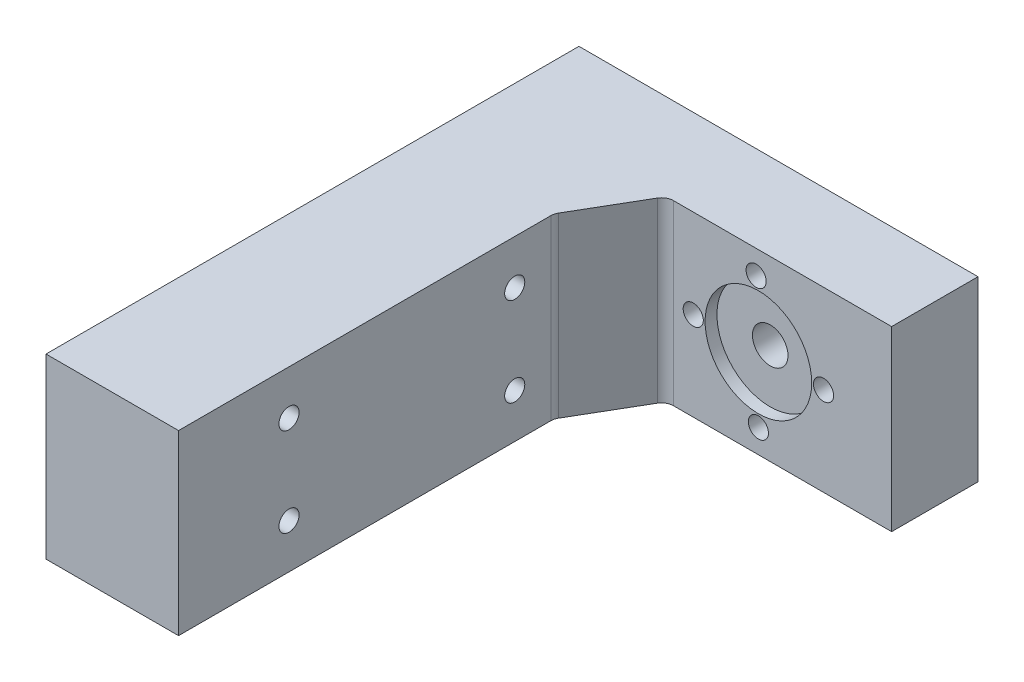
ISO-10303-21;
HEADER;
FILE_DESCRIPTION(('STEP AP214'),'2;1');
FILE_NAME('part.step','',(''),(''),'','','');
FILE_SCHEMA(('AUTOMOTIVE_DESIGN { 1 0 10303 214 1 1 1 1 }'));
ENDSEC;
DATA;
#1=APPLICATION_CONTEXT('core data for automotive mechanical design processes');
#2=APPLICATION_PROTOCOL_DEFINITION('international standard','automotive_design',2000,#1);
#3=PRODUCT_CONTEXT('',#1,'mechanical');
#4=PRODUCT('Part','Part','',(#3));
#5=PRODUCT_RELATED_PRODUCT_CATEGORY('part','',(#4));
#6=PRODUCT_DEFINITION_FORMATION('','',#4);
#7=PRODUCT_DEFINITION_CONTEXT('part definition',#1,'design');
#8=PRODUCT_DEFINITION('design','',#6,#7);
#9=PRODUCT_DEFINITION_SHAPE('','',#8);
#10=(LENGTH_UNIT() NAMED_UNIT(*) SI_UNIT(.MILLI.,.METRE.));
#11=(NAMED_UNIT(*) PLANE_ANGLE_UNIT() SI_UNIT($,.RADIAN.));
#12=(NAMED_UNIT(*) SI_UNIT($,.STERADIAN.) SOLID_ANGLE_UNIT());
#13=UNCERTAINTY_MEASURE_WITH_UNIT(LENGTH_MEASURE(1.E-05),#10,'distance_accuracy_value','');
#14=(GEOMETRIC_REPRESENTATION_CONTEXT(3) GLOBAL_UNCERTAINTY_ASSIGNED_CONTEXT((#13)) GLOBAL_UNIT_ASSIGNED_CONTEXT((#10,
#11,#12)) REPRESENTATION_CONTEXT('',''));
#15=CARTESIAN_POINT('',(0.,0.,0.));
#16=DIRECTION('',(0.,0.,1.));
#17=DIRECTION('',(1.,0.,0.));
#18=AXIS2_PLACEMENT_3D('',#15,#16,#17);
#19=CARTESIAN_POINT('',(-456.223221322454,150.000100005572,321.794313538758));
#20=DIRECTION('',(0.,0.,1.));
#21=DIRECTION('',(1.,0.,0.));
#22=AXIS2_PLACEMENT_3D('',#19,#20,#21);
#23=CYLINDRICAL_SURFACE('',#22,3.);
#24=CARTESIAN_POINT('',(-456.223221322454,150.000100005572,321.794313538758));
#25=DIRECTION('',(0.,0.,1.));
#26=DIRECTION('',(1.,0.,0.));
#27=AXIS2_PLACEMENT_3D('',#24,#25,#26);
#28=CIRCLE('',#27,3.);
#29=CARTESIAN_POINT('',(-453.223221322454,150.000100005572,321.794313538758));
#30=VERTEX_POINT('',#29);
#31=EDGE_CURVE('E164',#30,#30,#28,.T.);
#32=ORIENTED_EDGE('',*,*,#31,.F.);
#33=EDGE_LOOP('',(#32));
#34=FACE_BOUND('',#33,.T.);
#35=CARTESIAN_POINT('',(-456.223221322454,150.000100005572,334.378645983454));
#36=DIRECTION('',(0.,0.,1.));
#37=DIRECTION('',(1.,0.,0.));
#38=AXIS2_PLACEMENT_3D('',#35,#36,#37);
#39=CIRCLE('',#38,3.);
#40=CARTESIAN_POINT('',(-453.223221322454,150.000100005572,334.378645983454));
#41=VERTEX_POINT('',#40);
#42=EDGE_CURVE('E162',#41,#41,#39,.F.);
#43=ORIENTED_EDGE('',*,*,#42,.F.);
#44=EDGE_LOOP('',(#43));
#45=FACE_BOUND('',#44,.T.);
#46=ADVANCED_FACE('F55',(#34,#45),#23,.F.);
#47=CARTESIAN_POINT('',(-433.723221322454,165.000100005572,336.378645983454));
#48=DIRECTION('',(-1.,0.,0.));
#49=DIRECTION('',(0.,0.,1.));
#50=AXIS2_PLACEMENT_3D('',#47,#48,#49);
#51=PLANE('',#50);
#52=DIRECTION('',(0.,0.,-1.));
#53=VECTOR('',#52,1.);
#54=CARTESIAN_POINT('',(-433.723221322454,135.000100005572,336.378645983454));
#55=LINE('',#54,#53);
#56=CARTESIAN_POINT('',(-433.723221322454,135.000100005572,336.378645983454));
#57=VERTEX_POINT('',#56);
#58=CARTESIAN_POINT('',(-433.723221322454,135.000100005572,321.794313538758));
#59=VERTEX_POINT('',#58);
#60=EDGE_CURVE('E148',#57,#59,#55,.T.);
#61=ORIENTED_EDGE('',*,*,#60,.T.);
#62=DIRECTION('',(0.,-1.,0.));
#63=VECTOR('',#62,1.);
#64=CARTESIAN_POINT('',(-433.723221322454,165.000100005572,321.794313538758));
#65=LINE('',#64,#63);
#66=CARTESIAN_POINT('',(-433.723221322454,165.000100005572,321.794313538758));
#67=VERTEX_POINT('',#66);
#68=EDGE_CURVE('E129',#67,#59,#65,.T.);
#69=ORIENTED_EDGE('',*,*,#68,.F.);
#70=DIRECTION('',(0.,0.,-1.));
#71=VECTOR('',#70,1.);
#72=CARTESIAN_POINT('',(-433.723221322454,165.000100005572,336.378645983454));
#73=LINE('',#72,#71);
#74=CARTESIAN_POINT('',(-433.723221322454,165.000100005572,336.378645983454));
#75=VERTEX_POINT('',#74);
#76=EDGE_CURVE('E138',#75,#67,#73,.T.);
#77=ORIENTED_EDGE('',*,*,#76,.F.);
#78=DIRECTION('',(0.,-1.,0.));
#79=VECTOR('',#78,1.);
#80=CARTESIAN_POINT('',(-433.723221322454,165.000100005572,336.378645983454));
#81=LINE('',#80,#79);
#82=EDGE_CURVE('E218',#75,#57,#81,.T.);
#83=ORIENTED_EDGE('',*,*,#82,.T.);
#84=EDGE_LOOP('',(#61,#69,#77,#83));
#85=FACE_BOUND('',#84,.T.);
#86=ADVANCED_FACE('F149',(#85),#51,.F.);
#87=CARTESIAN_POINT('',(-433.723221322454,165.000100005572,321.794313538758));
#88=DIRECTION('',(0.,0.,1.));
#89=DIRECTION('',(1.,0.,0.));
#90=AXIS2_PLACEMENT_3D('',#87,#88,#89);
#91=PLANE('',#90);
#92=CARTESIAN_POINT('',(-467.223221322454,150.000100005572,321.794313538758));
#93=DIRECTION('',(0.,0.,1.));
#94=DIRECTION('',(1.,0.,0.));
#95=AXIS2_PLACEMENT_3D('',#92,#93,#94);
#96=CIRCLE('',#95,1.7);
#97=CARTESIAN_POINT('',(-465.523221322454,150.000100005572,321.794313538758));
#98=VERTEX_POINT('',#97);
#99=EDGE_CURVE('E240',#98,#98,#96,.T.);
#100=ORIENTED_EDGE('',*,*,#99,.T.);
#101=EDGE_LOOP('',(#100));
#102=FACE_BOUND('',#101,.T.);
#103=ORIENTED_EDGE('',*,*,#31,.T.);
#104=EDGE_LOOP('',(#103));
#105=FACE_BOUND('',#104,.T.);
#106=CARTESIAN_POINT('',(-456.223221322454,139.000100005572,321.794313538758));
#107=DIRECTION('',(0.,0.,1.));
#108=DIRECTION('',(1.,0.,0.));
#109=AXIS2_PLACEMENT_3D('',#106,#107,#108);
#110=CIRCLE('',#109,1.7);
#111=CARTESIAN_POINT('',(-454.523221322454,139.000100005572,321.794313538758));
#112=VERTEX_POINT('',#111);
#113=EDGE_CURVE('E270',#112,#112,#110,.T.);
#114=ORIENTED_EDGE('',*,*,#113,.T.);
#115=EDGE_LOOP('',(#114));
#116=FACE_BOUND('',#115,.T.);
#117=CARTESIAN_POINT('',(-445.223221322454,150.000100005572,321.794313538758));
#118=DIRECTION('',(0.,0.,1.));
#119=DIRECTION('',(1.,0.,0.));
#120=AXIS2_PLACEMENT_3D('',#117,#118,#119);
#121=CIRCLE('',#120,1.7);
#122=CARTESIAN_POINT('',(-443.523221322454,150.000100005572,321.794313538758));
#123=VERTEX_POINT('',#122);
#124=EDGE_CURVE('E246',#123,#123,#121,.T.);
#125=ORIENTED_EDGE('',*,*,#124,.T.);
#126=EDGE_LOOP('',(#125));
#127=FACE_BOUND('',#126,.T.);
#128=CARTESIAN_POINT('',(-456.605519190283,160.993454741059,321.794313538758));
#129=DIRECTION('',(0.,0.,1.));
#130=DIRECTION('',(1.,0.,0.));
#131=AXIS2_PLACEMENT_3D('',#128,#129,#130);
#132=CIRCLE('',#131,1.7);
#133=CARTESIAN_POINT('',(-454.905519190283,160.993454741059,321.794313538758));
#134=VERTEX_POINT('',#133);
#135=EDGE_CURVE('E253',#134,#134,#132,.T.);
#136=ORIENTED_EDGE('',*,*,#135,.T.);
#137=EDGE_LOOP('',(#136));
#138=FACE_BOUND('',#137,.T.);
#139=DIRECTION('',(-1.,0.,0.));
#140=VECTOR('',#139,1.);
#141=CARTESIAN_POINT('',(-433.723221322454,135.000100005572,321.794313538758));
#142=LINE('',#141,#140);
#143=CARTESIAN_POINT('',(-501.108556190435,135.000100005572,321.794313538758));
#144=VERTEX_POINT('',#143);
#145=EDGE_CURVE('E229',#59,#144,#142,.T.);
#146=ORIENTED_EDGE('',*,*,#145,.T.);
#147=DIRECTION('',(0.,-1.,0.));
#148=VECTOR('',#147,1.);
#149=CARTESIAN_POINT('',(-501.108556190435,165.000100005572,321.794313538758));
#150=LINE('',#149,#148);
#151=CARTESIAN_POINT('',(-501.108556190435,165.000100005572,321.794313538758));
#152=VERTEX_POINT('',#151);
#153=EDGE_CURVE('E133',#152,#144,#150,.T.);
#154=ORIENTED_EDGE('',*,*,#153,.F.);
#155=DIRECTION('',(-1.,0.,0.));
#156=VECTOR('',#155,1.);
#157=CARTESIAN_POINT('',(-433.723221322454,165.000100005572,321.794313538758));
#158=LINE('',#157,#156);
#159=EDGE_CURVE('E121',#67,#152,#158,.T.);
#160=ORIENTED_EDGE('',*,*,#159,.F.);
#161=ORIENTED_EDGE('',*,*,#68,.T.);
#162=EDGE_LOOP('',(#146,#154,#160,#161));
#163=FACE_BOUND('',#162,.T.);
#164=ADVANCED_FACE('F127',(#102,#105,#116,#127,#138,#163),#91,.F.);
#165=CARTESIAN_POINT('',(-501.108556190435,165.000100005572,321.794313538758));
#166=DIRECTION('',(1.,0.,0.));
#167=DIRECTION('',(0.,0.,-1.));
#168=AXIS2_PLACEMENT_3D('',#165,#166,#167);
#169=PLANE('',#168);
#170=CARTESIAN_POINT('',(-501.108556190435,157.500100005572,393.144313538758));
#171=DIRECTION('',(1.,0.,0.));
#172=DIRECTION('',(0.,0.,-1.));
#173=AXIS2_PLACEMENT_3D('',#170,#171,#172);
#174=CIRCLE('',#173,1.7);
#175=CARTESIAN_POINT('',(-501.108556190435,157.500100005572,391.444313538758));
#176=VERTEX_POINT('',#175);
#177=EDGE_CURVE('E304',#176,#176,#174,.T.);
#178=ORIENTED_EDGE('',*,*,#177,.T.);
#179=EDGE_LOOP('',(#178));
#180=FACE_BOUND('',#179,.T.);
#181=CARTESIAN_POINT('',(-501.108556190435,142.500100005572,355.028645983454));
#182=DIRECTION('',(1.,0.,0.));
#183=DIRECTION('',(0.,0.,-1.));
#184=AXIS2_PLACEMENT_3D('',#181,#182,#183);
#185=CIRCLE('',#184,1.7);
#186=CARTESIAN_POINT('',(-501.108556190435,142.500100005572,353.328645983454));
#187=VERTEX_POINT('',#186);
#188=EDGE_CURVE('E298',#187,#187,#185,.T.);
#189=ORIENTED_EDGE('',*,*,#188,.T.);
#190=EDGE_LOOP('',(#189));
#191=FACE_BOUND('',#190,.T.);
#192=CARTESIAN_POINT('',(-501.108556190435,157.500100005572,355.028645983454));
#193=DIRECTION('',(1.,0.,0.));
#194=DIRECTION('',(0.,0.,-1.));
#195=AXIS2_PLACEMENT_3D('',#192,#193,#194);
#196=CIRCLE('',#195,1.7);
#197=CARTESIAN_POINT('',(-501.108556190435,157.500100005572,353.328645983454));
#198=VERTEX_POINT('',#197);
#199=EDGE_CURVE('E315',#198,#198,#196,.T.);
#200=ORIENTED_EDGE('',*,*,#199,.T.);
#201=EDGE_LOOP('',(#200));
#202=FACE_BOUND('',#201,.T.);
#203=CARTESIAN_POINT('',(-501.108556190435,142.500100005572,393.144313538758));
#204=DIRECTION('',(1.,0.,0.));
#205=DIRECTION('',(0.,0.,-1.));
#206=AXIS2_PLACEMENT_3D('',#203,#204,#205);
#207=CIRCLE('',#206,1.7);
#208=CARTESIAN_POINT('',(-501.108556190435,142.500100005572,391.444313538758));
#209=VERTEX_POINT('',#208);
#210=EDGE_CURVE('E284',#209,#209,#207,.T.);
#211=ORIENTED_EDGE('',*,*,#210,.T.);
#212=EDGE_LOOP('',(#211));
#213=FACE_BOUND('',#212,.T.);
#214=DIRECTION('',(0.,0.,1.));
#215=VECTOR('',#214,1.);
#216=CARTESIAN_POINT('',(-501.108556190435,135.000100005572,321.794313538758));
#217=LINE('',#216,#215);
#218=CARTESIAN_POINT('',(-501.108556190435,135.000100005572,411.794313538758));
#219=VERTEX_POINT('',#218);
#220=EDGE_CURVE('E215',#144,#219,#217,.T.);
#221=ORIENTED_EDGE('',*,*,#220,.T.);
#222=DIRECTION('',(0.,-1.,0.));
#223=VECTOR('',#222,1.);
#224=CARTESIAN_POINT('',(-501.108556190435,165.000100005572,411.794313538758));
#225=LINE('',#224,#223);
#226=CARTESIAN_POINT('',(-501.108556190435,165.000100005572,411.794313538758));
#227=VERTEX_POINT('',#226);
#228=EDGE_CURVE('E156',#227,#219,#225,.T.);
#229=ORIENTED_EDGE('',*,*,#228,.F.);
#230=DIRECTION('',(0.,0.,1.));
#231=VECTOR('',#230,1.);
#232=CARTESIAN_POINT('',(-501.108556190435,165.000100005572,321.794313538758));
#233=LINE('',#232,#231);
#234=EDGE_CURVE('E132',#152,#227,#233,.T.);
#235=ORIENTED_EDGE('',*,*,#234,.F.);
#236=ORIENTED_EDGE('',*,*,#153,.T.);
#237=EDGE_LOOP('',(#221,#229,#235,#236));
#238=FACE_BOUND('',#237,.T.);
#239=ADVANCED_FACE('F380',(#180,#191,#202,#213,#238),#169,.F.);
#240=CARTESIAN_POINT('',(-501.108556190435,165.000100005572,411.794313538758));
#241=DIRECTION('',(0.,0.,-1.));
#242=DIRECTION('',(-1.,0.,0.));
#243=AXIS2_PLACEMENT_3D('',#240,#241,#242);
#244=PLANE('',#243);
#245=DIRECTION('',(1.,0.,0.));
#246=VECTOR('',#245,1.);
#247=CARTESIAN_POINT('',(-501.108556190435,135.000100005572,411.794313538758));
#248=LINE('',#247,#246);
#249=CARTESIAN_POINT('',(-478.723221322454,135.000100005572,411.794313538758));
#250=VERTEX_POINT('',#249);
#251=EDGE_CURVE('E210',#219,#250,#248,.T.);
#252=ORIENTED_EDGE('',*,*,#251,.T.);
#253=DIRECTION('',(0.,-1.,0.));
#254=VECTOR('',#253,1.);
#255=CARTESIAN_POINT('',(-478.723221322454,165.000100005572,411.794313538758));
#256=LINE('',#255,#254);
#257=CARTESIAN_POINT('',(-478.723221322454,165.000100005572,411.794313538758));
#258=VERTEX_POINT('',#257);
#259=EDGE_CURVE('E202',#258,#250,#256,.T.);
#260=ORIENTED_EDGE('',*,*,#259,.F.);
#261=DIRECTION('',(1.,0.,0.));
#262=VECTOR('',#261,1.);
#263=CARTESIAN_POINT('',(-501.108556190435,165.000100005572,411.794313538758));
#264=LINE('',#263,#262);
#265=EDGE_CURVE('E228',#227,#258,#264,.T.);
#266=ORIENTED_EDGE('',*,*,#265,.F.);
#267=ORIENTED_EDGE('',*,*,#228,.T.);
#268=EDGE_LOOP('',(#252,#260,#266,#267));
#269=FACE_BOUND('',#268,.T.);
#270=ADVANCED_FACE('F224',(#269),#244,.F.);
#271=CARTESIAN_POINT('',(-478.723221322454,165.000100005572,411.794313538758));
#272=DIRECTION('',(-1.,0.,0.));
#273=DIRECTION('',(0.,0.,1.));
#274=AXIS2_PLACEMENT_3D('',#271,#272,#273);
#275=PLANE('',#274);
#276=CARTESIAN_POINT('',(-478.723221322454,157.500100005572,393.144313538758));
#277=DIRECTION('',(1.,0.,0.));
#278=DIRECTION('',(0.,0.,-1.));
#279=AXIS2_PLACEMENT_3D('',#276,#277,#278);
#280=CIRCLE('',#279,1.7);
#281=CARTESIAN_POINT('',(-478.723221322454,157.500100005572,391.444313538758));
#282=VERTEX_POINT('',#281);
#283=EDGE_CURVE('E292',#282,#282,#280,.T.);
#284=ORIENTED_EDGE('',*,*,#283,.F.);
#285=EDGE_LOOP('',(#284));
#286=FACE_BOUND('',#285,.T.);
#287=CARTESIAN_POINT('',(-478.723221322454,142.500100005572,355.028645983454));
#288=DIRECTION('',(1.,0.,0.));
#289=DIRECTION('',(0.,0.,-1.));
#290=AXIS2_PLACEMENT_3D('',#287,#288,#289);
#291=CIRCLE('',#290,1.7);
#292=CARTESIAN_POINT('',(-478.723221322454,142.500100005572,353.328645983454));
#293=VERTEX_POINT('',#292);
#294=EDGE_CURVE('E297',#293,#293,#291,.T.);
#295=ORIENTED_EDGE('',*,*,#294,.F.);
#296=EDGE_LOOP('',(#295));
#297=FACE_BOUND('',#296,.T.);
#298=CARTESIAN_POINT('',(-478.723221322454,157.500100005572,355.028645983454));
#299=DIRECTION('',(1.,0.,0.));
#300=DIRECTION('',(0.,0.,-1.));
#301=AXIS2_PLACEMENT_3D('',#298,#299,#300);
#302=CIRCLE('',#301,1.7);
#303=CARTESIAN_POINT('',(-478.723221322454,157.500100005572,353.328645983454));
#304=VERTEX_POINT('',#303);
#305=EDGE_CURVE('E301',#304,#304,#302,.T.);
#306=ORIENTED_EDGE('',*,*,#305,.F.);
#307=EDGE_LOOP('',(#306));
#308=FACE_BOUND('',#307,.T.);
#309=CARTESIAN_POINT('',(-478.723221322454,142.500100005572,393.144313538758));
#310=DIRECTION('',(1.,0.,0.));
#311=DIRECTION('',(0.,0.,-1.));
#312=AXIS2_PLACEMENT_3D('',#309,#310,#311);
#313=CIRCLE('',#312,1.7);
#314=CARTESIAN_POINT('',(-478.723221322454,142.500100005572,391.444313538758));
#315=VERTEX_POINT('',#314);
#316=EDGE_CURVE('E286',#315,#315,#313,.T.);
#317=ORIENTED_EDGE('',*,*,#316,.F.);
#318=EDGE_LOOP('',(#317));
#319=FACE_BOUND('',#318,.T.);
#320=DIRECTION('',(0.,0.,-1.));
#321=VECTOR('',#320,1.);
#322=CARTESIAN_POINT('',(-478.723221322454,135.000100005572,411.794313538758));
#323=LINE('',#322,#321);
#324=CARTESIAN_POINT('',(-478.723221322454,135.000100005572,348.919344266154));
#325=VERTEX_POINT('',#324);
#326=EDGE_CURVE('E205',#250,#325,#323,.T.);
#327=ORIENTED_EDGE('',*,*,#326,.T.);
#328=DIRECTION('',(0.,-1.,0.));
#329=VECTOR('',#328,1.);
#330=CARTESIAN_POINT('',(-478.723221322454,165.000100005572,348.919344266154));
#331=LINE('',#330,#329);
#332=CARTESIAN_POINT('',(-478.723221322454,165.000100005572,348.919344266154));
#333=VERTEX_POINT('',#332);
#334=EDGE_CURVE('E181',#325,#333,#331,.F.);
#335=ORIENTED_EDGE('',*,*,#334,.T.);
#336=DIRECTION('',(0.,0.,-1.));
#337=VECTOR('',#336,1.);
#338=CARTESIAN_POINT('',(-478.723221322454,165.000100005572,411.794313538758));
#339=LINE('',#338,#337);
#340=EDGE_CURVE('E191',#258,#333,#339,.T.);
#341=ORIENTED_EDGE('',*,*,#340,.F.);
#342=ORIENTED_EDGE('',*,*,#259,.T.);
#343=EDGE_LOOP('',(#327,#335,#341,#342));
#344=FACE_BOUND('',#343,.T.);
#345=ADVANCED_FACE('F197',(#286,#297,#308,#319,#344),#275,.F.);
#346=CARTESIAN_POINT('',(-478.723221322454,165.000100005572,336.378645983454));
#347=DIRECTION('',(0.,0.,-1.));
#348=DIRECTION('',(-1.,0.,0.));
#349=AXIS2_PLACEMENT_3D('',#346,#347,#348);
#350=PLANE('',#349);
#351=CARTESIAN_POINT('',(-456.223221322454,150.000100005572,336.378645983454));
#352=DIRECTION('',(0.,0.,1.));
#353=DIRECTION('',(1.,0.,0.));
#354=AXIS2_PLACEMENT_3D('',#351,#352,#353);
#355=CIRCLE('',#354,9.);
#356=CARTESIAN_POINT('',(-447.223221322454,150.000100005572,336.378645983454));
#357=VERTEX_POINT('',#356);
#358=EDGE_CURVE('E278',#357,#357,#355,.T.);
#359=ORIENTED_EDGE('',*,*,#358,.F.);
#360=EDGE_LOOP('',(#359));
#361=FACE_BOUND('',#360,.T.);
#362=CARTESIAN_POINT('',(-467.223221322454,150.000100005572,336.378645983454));
#363=DIRECTION('',(0.,0.,1.));
#364=DIRECTION('',(1.,0.,0.));
#365=AXIS2_PLACEMENT_3D('',#362,#363,#364);
#366=CIRCLE('',#365,1.7);
#367=CARTESIAN_POINT('',(-465.523221322454,150.000100005572,336.378645983454));
#368=VERTEX_POINT('',#367);
#369=EDGE_CURVE('E261',#368,#368,#366,.T.);
#370=ORIENTED_EDGE('',*,*,#369,.F.);
#371=EDGE_LOOP('',(#370));
#372=FACE_BOUND('',#371,.T.);
#373=CARTESIAN_POINT('',(-456.223221322454,139.000100005572,336.378645983454));
#374=DIRECTION('',(0.,0.,1.));
#375=DIRECTION('',(1.,0.,0.));
#376=AXIS2_PLACEMENT_3D('',#373,#374,#375);
#377=CIRCLE('',#376,1.7);
#378=CARTESIAN_POINT('',(-454.523221322454,139.000100005572,336.378645983454));
#379=VERTEX_POINT('',#378);
#380=EDGE_CURVE('E252',#379,#379,#377,.T.);
#381=ORIENTED_EDGE('',*,*,#380,.F.);
#382=EDGE_LOOP('',(#381));
#383=FACE_BOUND('',#382,.T.);
#384=CARTESIAN_POINT('',(-445.223221322454,150.000100005572,336.378645983454));
#385=DIRECTION('',(0.,0.,1.));
#386=DIRECTION('',(1.,0.,0.));
#387=AXIS2_PLACEMENT_3D('',#384,#385,#386);
#388=CIRCLE('',#387,1.7);
#389=CARTESIAN_POINT('',(-443.523221322454,150.000100005572,336.378645983454));
#390=VERTEX_POINT('',#389);
#391=EDGE_CURVE('E249',#390,#390,#388,.T.);
#392=ORIENTED_EDGE('',*,*,#391,.F.);
#393=EDGE_LOOP('',(#392));
#394=FACE_BOUND('',#393,.T.);
#395=CARTESIAN_POINT('',(-456.605519190283,160.993454741059,336.378645983454));
#396=DIRECTION('',(0.,0.,1.));
#397=DIRECTION('',(1.,0.,0.));
#398=AXIS2_PLACEMENT_3D('',#395,#396,#397);
#399=CIRCLE('',#398,1.7);
#400=CARTESIAN_POINT('',(-454.905519190283,160.993454741059,336.378645983454));
#401=VERTEX_POINT('',#400);
#402=EDGE_CURVE('E256',#401,#401,#399,.T.);
#403=ORIENTED_EDGE('',*,*,#402,.F.);
#404=EDGE_LOOP('',(#403));
#405=FACE_BOUND('',#404,.T.);
#406=DIRECTION('',(1.,0.,0.));
#407=VECTOR('',#406,1.);
#408=CARTESIAN_POINT('',(-478.723221322454,165.000100005572,336.378645983454));
#409=LINE('',#408,#407);
#410=CARTESIAN_POINT('',(-470.574480657546,165.000100005572,336.378645983454));
#411=VERTEX_POINT('',#410);
#412=EDGE_CURVE('E142',#411,#75,#409,.T.);
#413=ORIENTED_EDGE('',*,*,#412,.F.);
#414=DIRECTION('',(0.,1.,0.));
#415=VECTOR('',#414,1.);
#416=CARTESIAN_POINT('',(-470.574480657546,135.000100005572,336.378645983454));
#417=LINE('',#416,#415);
#418=CARTESIAN_POINT('',(-470.574480657546,135.000100005572,336.378645983454));
#419=VERTEX_POINT('',#418);
#420=EDGE_CURVE('E171',#411,#419,#417,.F.);
#421=ORIENTED_EDGE('',*,*,#420,.T.);
#422=DIRECTION('',(1.,0.,0.));
#423=VECTOR('',#422,1.);
#424=CARTESIAN_POINT('',(-478.723221322454,135.000100005572,336.378645983454));
#425=LINE('',#424,#423);
#426=EDGE_CURVE('E147',#419,#57,#425,.T.);
#427=ORIENTED_EDGE('',*,*,#426,.T.);
#428=ORIENTED_EDGE('',*,*,#82,.F.);
#429=EDGE_LOOP('',(#413,#421,#427,#428));
#430=FACE_BOUND('',#429,.T.);
#431=ADVANCED_FACE('F321',(#361,#372,#383,#394,#405,#430),#350,.F.);
#432=CARTESIAN_POINT('',(-433.723221322454,165.000100005572,321.794313538758));
#433=DIRECTION('',(0.,1.,0.));
#434=DIRECTION('',(0.,0.,1.));
#435=AXIS2_PLACEMENT_3D('',#432,#433,#434);
#436=PLANE('',#435);
#437=ORIENTED_EDGE('',*,*,#76,.T.);
#438=ORIENTED_EDGE('',*,*,#159,.T.);
#439=ORIENTED_EDGE('',*,*,#234,.T.);
#440=ORIENTED_EDGE('',*,*,#265,.T.);
#441=ORIENTED_EDGE('',*,*,#340,.T.);
#442=CARTESIAN_POINT('',(-476.723221322454,165.000100005572,348.919344266154));
#443=DIRECTION('',(0.,1.,0.));
#444=DIRECTION('',(0.,0.,1.));
#445=AXIS2_PLACEMENT_3D('',#442,#443,#444);
#446=CIRCLE('',#445,2.);
#447=CARTESIAN_POINT('',(-478.450779124251,165.000100005572,347.911602215106));
#448=VERTEX_POINT('',#447);
#449=EDGE_CURVE('E62',#333,#448,#446,.F.);
#450=ORIENTED_EDGE('',*,*,#449,.T.);
#451=DIRECTION('',(-0.503871025524086,0.,0.863778900898433));
#452=VECTOR('',#451,1.);
#453=CARTESIAN_POINT('',(-471.723221322454,165.000100005572,336.378645983454));
#454=LINE('',#453,#452);
#455=CARTESIAN_POINT('',(-472.302038459342,165.000100005572,337.370903932406));
#456=VERTEX_POINT('',#455);
#457=EDGE_CURVE('E158',#448,#456,#454,.F.);
#458=ORIENTED_EDGE('',*,*,#457,.T.);
#459=CARTESIAN_POINT('',(-470.574480657546,165.000100005572,338.378645983454));
#460=DIRECTION('',(0.,1.,0.));
#461=DIRECTION('',(0.,0.,1.));
#462=AXIS2_PLACEMENT_3D('',#459,#460,#461);
#463=CIRCLE('',#462,2.);
#464=EDGE_CURVE('E190',#456,#411,#463,.F.);
#465=ORIENTED_EDGE('',*,*,#464,.T.);
#466=ORIENTED_EDGE('',*,*,#412,.T.);
#467=EDGE_LOOP('',(#437,#438,#439,#440,#441,#450,#458,#465,#466));
#468=FACE_BOUND('',#467,.T.);
#469=ADVANCED_FACE('F137',(#468),#436,.T.);
#470=CARTESIAN_POINT('',(-433.723221322454,135.000100005572,321.794313538758));
#471=DIRECTION('',(0.,1.,0.));
#472=DIRECTION('',(0.,0.,1.));
#473=AXIS2_PLACEMENT_3D('',#470,#471,#472);
#474=PLANE('',#473);
#475=ORIENTED_EDGE('',*,*,#60,.F.);
#476=ORIENTED_EDGE('',*,*,#426,.F.);
#477=CARTESIAN_POINT('',(-470.574480657546,135.000100005572,338.378645983454));
#478=DIRECTION('',(0.,1.,0.));
#479=DIRECTION('',(0.,0.,1.));
#480=AXIS2_PLACEMENT_3D('',#477,#478,#479);
#481=CIRCLE('',#480,2.);
#482=CARTESIAN_POINT('',(-472.302038459342,135.000100005572,337.370903932406));
#483=VERTEX_POINT('',#482);
#484=EDGE_CURVE('E183',#419,#483,#481,.T.);
#485=ORIENTED_EDGE('',*,*,#484,.T.);
#486=DIRECTION('',(0.503871025524086,0.,-0.863778900898433));
#487=VECTOR('',#486,1.);
#488=CARTESIAN_POINT('',(-455.727967823208,135.000100005572,308.958211413318));
#489=LINE('',#488,#487);
#490=CARTESIAN_POINT('',(-478.450779124251,135.000100005572,347.911602215106));
#491=VERTEX_POINT('',#490);
#492=EDGE_CURVE('E155',#483,#491,#489,.F.);
#493=ORIENTED_EDGE('',*,*,#492,.T.);
#494=CARTESIAN_POINT('',(-476.723221322454,135.000100005572,348.919344266154));
#495=DIRECTION('',(0.,1.,0.));
#496=DIRECTION('',(0.,0.,1.));
#497=AXIS2_PLACEMENT_3D('',#494,#495,#496);
#498=CIRCLE('',#497,2.);
#499=EDGE_CURVE('E14',#491,#325,#498,.T.);
#500=ORIENTED_EDGE('',*,*,#499,.T.);
#501=ORIENTED_EDGE('',*,*,#326,.F.);
#502=ORIENTED_EDGE('',*,*,#251,.F.);
#503=ORIENTED_EDGE('',*,*,#220,.F.);
#504=ORIENTED_EDGE('',*,*,#145,.F.);
#505=EDGE_LOOP('',(#475,#476,#485,#493,#500,#501,#502,#503,#504));
#506=FACE_BOUND('',#505,.T.);
#507=ADVANCED_FACE('F230',(#506),#474,.F.);
#508=CARTESIAN_POINT('',(-456.605519190283,160.993454741059,321.794313538758));
#509=DIRECTION('',(0.,0.,1.));
#510=DIRECTION('',(1.,0.,0.));
#511=AXIS2_PLACEMENT_3D('',#508,#509,#510);
#512=CYLINDRICAL_SURFACE('',#511,1.7);
#513=ORIENTED_EDGE('',*,*,#135,.F.);
#514=EDGE_LOOP('',(#513));
#515=FACE_BOUND('',#514,.T.);
#516=ORIENTED_EDGE('',*,*,#402,.T.);
#517=EDGE_LOOP('',(#516));
#518=FACE_BOUND('',#517,.T.);
#519=ADVANCED_FACE('F359',(#515,#518),#512,.F.);
#520=CARTESIAN_POINT('',(-445.223221322454,150.000100005572,321.794313538758));
#521=DIRECTION('',(0.,0.,1.));
#522=DIRECTION('',(1.,0.,0.));
#523=AXIS2_PLACEMENT_3D('',#520,#521,#522);
#524=CYLINDRICAL_SURFACE('',#523,1.7);
#525=ORIENTED_EDGE('',*,*,#124,.F.);
#526=EDGE_LOOP('',(#525));
#527=FACE_BOUND('',#526,.T.);
#528=ORIENTED_EDGE('',*,*,#391,.T.);
#529=EDGE_LOOP('',(#528));
#530=FACE_BOUND('',#529,.T.);
#531=ADVANCED_FACE('F361',(#527,#530),#524,.F.);
#532=CARTESIAN_POINT('',(-456.223221322454,139.000100005572,321.794313538758));
#533=DIRECTION('',(0.,0.,1.));
#534=DIRECTION('',(1.,0.,0.));
#535=AXIS2_PLACEMENT_3D('',#532,#533,#534);
#536=CYLINDRICAL_SURFACE('',#535,1.7);
#537=ORIENTED_EDGE('',*,*,#113,.F.);
#538=EDGE_LOOP('',(#537));
#539=FACE_BOUND('',#538,.T.);
#540=ORIENTED_EDGE('',*,*,#380,.T.);
#541=EDGE_LOOP('',(#540));
#542=FACE_BOUND('',#541,.T.);
#543=ADVANCED_FACE('F356',(#539,#542),#536,.F.);
#544=CARTESIAN_POINT('',(-467.223221322454,150.000100005572,321.794313538758));
#545=DIRECTION('',(0.,0.,1.));
#546=DIRECTION('',(1.,0.,0.));
#547=AXIS2_PLACEMENT_3D('',#544,#545,#546);
#548=CYLINDRICAL_SURFACE('',#547,1.7);
#549=ORIENTED_EDGE('',*,*,#99,.F.);
#550=EDGE_LOOP('',(#549));
#551=FACE_BOUND('',#550,.T.);
#552=ORIENTED_EDGE('',*,*,#369,.T.);
#553=EDGE_LOOP('',(#552));
#554=FACE_BOUND('',#553,.T.);
#555=ADVANCED_FACE('F448',(#551,#554),#548,.F.);
#556=CARTESIAN_POINT('',(-456.223221322454,150.000100005572,334.378645983454));
#557=DIRECTION('',(0.,0.,1.));
#558=DIRECTION('',(1.,0.,0.));
#559=AXIS2_PLACEMENT_3D('',#556,#557,#558);
#560=PLANE('',#559);
#561=CARTESIAN_POINT('',(-456.223221322454,150.000100005572,334.378645983454));
#562=DIRECTION('',(0.,0.,1.));
#563=DIRECTION('',(1.,0.,0.));
#564=AXIS2_PLACEMENT_3D('',#561,#562,#563);
#565=CIRCLE('',#564,9.);
#566=CARTESIAN_POINT('',(-447.223221322454,150.000100005572,334.378645983454));
#567=VERTEX_POINT('',#566);
#568=EDGE_CURVE('E168',#567,#567,#565,.T.);
#569=ORIENTED_EDGE('',*,*,#568,.T.);
#570=EDGE_LOOP('',(#569));
#571=FACE_BOUND('',#570,.T.);
#572=ORIENTED_EDGE('',*,*,#42,.T.);
#573=EDGE_LOOP('',(#572));
#574=FACE_BOUND('',#573,.T.);
#575=ADVANCED_FACE('F342',(#571,#574),#560,.T.);
#576=CARTESIAN_POINT('',(-456.223221322454,150.000100005572,334.378645983454));
#577=DIRECTION('',(0.,0.,1.));
#578=DIRECTION('',(1.,0.,0.));
#579=AXIS2_PLACEMENT_3D('',#576,#577,#578);
#580=CYLINDRICAL_SURFACE('',#579,9.);
#581=ORIENTED_EDGE('',*,*,#568,.F.);
#582=EDGE_LOOP('',(#581));
#583=FACE_BOUND('',#582,.T.);
#584=ORIENTED_EDGE('',*,*,#358,.T.);
#585=EDGE_LOOP('',(#584));
#586=FACE_BOUND('',#585,.T.);
#587=ADVANCED_FACE('F333',(#583,#586),#580,.F.);
#588=CARTESIAN_POINT('',(-501.108556190435,142.500100005572,393.144313538758));
#589=DIRECTION('',(1.,0.,0.));
#590=DIRECTION('',(0.,0.,-1.));
#591=AXIS2_PLACEMENT_3D('',#588,#589,#590);
#592=CYLINDRICAL_SURFACE('',#591,1.7);
#593=ORIENTED_EDGE('',*,*,#210,.F.);
#594=EDGE_LOOP('',(#593));
#595=FACE_BOUND('',#594,.T.);
#596=ORIENTED_EDGE('',*,*,#316,.T.);
#597=EDGE_LOOP('',(#596));
#598=FACE_BOUND('',#597,.T.);
#599=ADVANCED_FACE('F329',(#595,#598),#592,.F.);
#600=CARTESIAN_POINT('',(-501.108556190435,157.500100005572,355.028645983454));
#601=DIRECTION('',(1.,0.,0.));
#602=DIRECTION('',(0.,0.,-1.));
#603=AXIS2_PLACEMENT_3D('',#600,#601,#602);
#604=CYLINDRICAL_SURFACE('',#603,1.7);
#605=ORIENTED_EDGE('',*,*,#199,.F.);
#606=EDGE_LOOP('',(#605));
#607=FACE_BOUND('',#606,.T.);
#608=ORIENTED_EDGE('',*,*,#305,.T.);
#609=EDGE_LOOP('',(#608));
#610=FACE_BOUND('',#609,.T.);
#611=ADVANCED_FACE('F318',(#607,#610),#604,.F.);
#612=CARTESIAN_POINT('',(-501.108556190435,142.500100005572,355.028645983454));
#613=DIRECTION('',(1.,0.,0.));
#614=DIRECTION('',(0.,0.,-1.));
#615=AXIS2_PLACEMENT_3D('',#612,#613,#614);
#616=CYLINDRICAL_SURFACE('',#615,1.7);
#617=ORIENTED_EDGE('',*,*,#188,.F.);
#618=EDGE_LOOP('',(#617));
#619=FACE_BOUND('',#618,.T.);
#620=ORIENTED_EDGE('',*,*,#294,.T.);
#621=EDGE_LOOP('',(#620));
#622=FACE_BOUND('',#621,.T.);
#623=ADVANCED_FACE('F336',(#619,#622),#616,.F.);
#624=CARTESIAN_POINT('',(-501.108556190435,157.500100005572,393.144313538758));
#625=DIRECTION('',(1.,0.,0.));
#626=DIRECTION('',(0.,0.,-1.));
#627=AXIS2_PLACEMENT_3D('',#624,#625,#626);
#628=CYLINDRICAL_SURFACE('',#627,1.7);
#629=ORIENTED_EDGE('',*,*,#177,.F.);
#630=EDGE_LOOP('',(#629));
#631=FACE_BOUND('',#630,.T.);
#632=ORIENTED_EDGE('',*,*,#283,.T.);
#633=EDGE_LOOP('',(#632));
#634=FACE_BOUND('',#633,.T.);
#635=ADVANCED_FACE('F387',(#631,#634),#628,.F.);
#636=CARTESIAN_POINT('',(-471.723221322454,165.000100005572,336.378645983454));
#637=DIRECTION('',(0.863778900898433,0.,0.503871025524086));
#638=DIRECTION('',(0.,1.,0.));
#639=AXIS2_PLACEMENT_3D('',#636,#637,#638);
#640=PLANE('',#639);
#641=ORIENTED_EDGE('',*,*,#492,.F.);
#642=DIRECTION('',(0.,-1.,0.));
#643=VECTOR('',#642,1.);
#644=CARTESIAN_POINT('',(-472.302038459342,165.000100005572,337.370903932406));
#645=LINE('',#644,#643);
#646=EDGE_CURVE('E178',#483,#456,#645,.F.);
#647=ORIENTED_EDGE('',*,*,#646,.T.);
#648=ORIENTED_EDGE('',*,*,#457,.F.);
#649=DIRECTION('',(0.,1.,0.));
#650=VECTOR('',#649,1.);
#651=CARTESIAN_POINT('',(-478.450779124251,135.000100005572,347.911602215106));
#652=LINE('',#651,#650);
#653=EDGE_CURVE('E174',#448,#491,#652,.F.);
#654=ORIENTED_EDGE('',*,*,#653,.T.);
#655=EDGE_LOOP('',(#641,#647,#648,#654));
#656=FACE_BOUND('',#655,.T.);
#657=ADVANCED_FACE('F200',(#656),#640,.T.);
#658=CARTESIAN_POINT('',(-470.574480657546,165.000100005572,338.378645983454));
#659=DIRECTION('',(0.,-1.,0.));
#660=DIRECTION('',(0.,0.,-1.));
#661=AXIS2_PLACEMENT_3D('',#658,#659,#660);
#662=CYLINDRICAL_SURFACE('',#661,2.);
#663=ORIENTED_EDGE('',*,*,#464,.F.);
#664=ORIENTED_EDGE('',*,*,#646,.F.);
#665=ORIENTED_EDGE('',*,*,#484,.F.);
#666=ORIENTED_EDGE('',*,*,#420,.F.);
#667=EDGE_LOOP('',(#663,#664,#665,#666));
#668=FACE_BOUND('',#667,.T.);
#669=ADVANCED_FACE('F383',(#668),#662,.F.);
#670=CARTESIAN_POINT('',(-476.723221322454,165.000100005572,348.919344266154));
#671=DIRECTION('',(0.,1.,0.));
#672=DIRECTION('',(0.,0.,1.));
#673=AXIS2_PLACEMENT_3D('',#670,#671,#672);
#674=CYLINDRICAL_SURFACE('',#673,2.);
#675=ORIENTED_EDGE('',*,*,#499,.F.);
#676=ORIENTED_EDGE('',*,*,#653,.F.);
#677=ORIENTED_EDGE('',*,*,#449,.F.);
#678=ORIENTED_EDGE('',*,*,#334,.F.);
#679=EDGE_LOOP('',(#675,#676,#677,#678));
#680=FACE_BOUND('',#679,.T.);
#681=ADVANCED_FACE('F53',(#680),#674,.F.);
#682=CLOSED_SHELL('',(#46,#86,#164,#239,#270,#345,#431,#469,#507,#519,#531,#543,#555,#575,#587,
#599,#611,#623,#635,#657,#669,#681));
#683=MANIFOLD_SOLID_BREP('B2',#682);
#684=ADVANCED_BREP_SHAPE_REPRESENTATION('',(#18,#683),#14);
#685=SHAPE_DEFINITION_REPRESENTATION(#9,#684);
ENDSEC;
END-ISO-10303-21;
